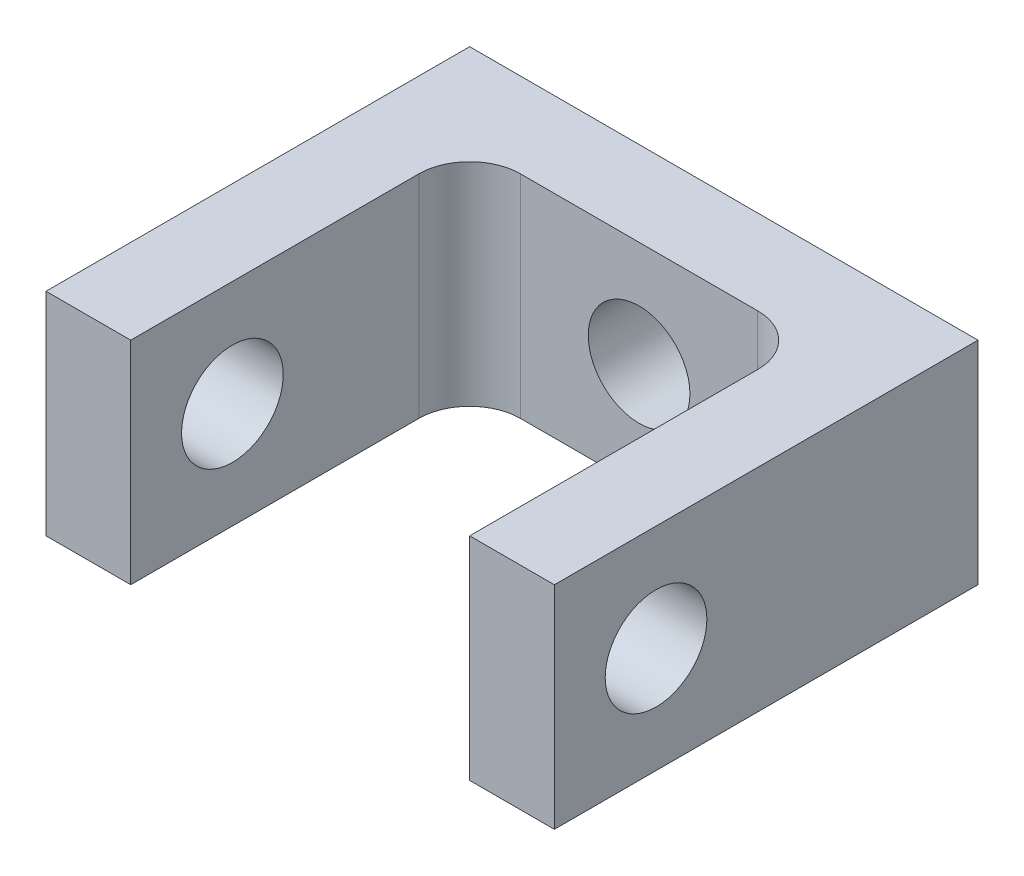
ISO-10303-21;
HEADER;
FILE_DESCRIPTION(('STEP AP214'),'2;1');
FILE_NAME('part.step','',(''),(''),'','','');
FILE_SCHEMA(('AUTOMOTIVE_DESIGN { 1 0 10303 214 1 1 1 1 }'));
ENDSEC;
DATA;
#1=APPLICATION_CONTEXT('core data for automotive mechanical design processes');
#2=APPLICATION_PROTOCOL_DEFINITION('international standard','automotive_design',2000,#1);
#3=PRODUCT_CONTEXT('',#1,'mechanical');
#4=PRODUCT('Part','Part','',(#3));
#5=PRODUCT_RELATED_PRODUCT_CATEGORY('part','',(#4));
#6=PRODUCT_DEFINITION_FORMATION('','',#4);
#7=PRODUCT_DEFINITION_CONTEXT('part definition',#1,'design');
#8=PRODUCT_DEFINITION('design','',#6,#7);
#9=PRODUCT_DEFINITION_SHAPE('','',#8);
#10=(LENGTH_UNIT() NAMED_UNIT(*) SI_UNIT(.MILLI.,.METRE.));
#11=(NAMED_UNIT(*) PLANE_ANGLE_UNIT() SI_UNIT($,.RADIAN.));
#12=(NAMED_UNIT(*) SI_UNIT($,.STERADIAN.) SOLID_ANGLE_UNIT());
#13=UNCERTAINTY_MEASURE_WITH_UNIT(LENGTH_MEASURE(1.E-05),#10,'distance_accuracy_value','');
#14=(GEOMETRIC_REPRESENTATION_CONTEXT(3) GLOBAL_UNCERTAINTY_ASSIGNED_CONTEXT((#13)) GLOBAL_UNIT_ASSIGNED_CONTEXT((#10,
#11,#12)) REPRESENTATION_CONTEXT('',''));
#15=CARTESIAN_POINT('',(0.,0.,0.));
#16=DIRECTION('',(0.,0.,1.));
#17=DIRECTION('',(1.,0.,0.));
#18=AXIS2_PLACEMENT_3D('',#15,#16,#17);
#19=CARTESIAN_POINT('',(0.,0.,10.));
#20=DIRECTION('',(0.,0.,-1.));
#21=DIRECTION('',(-1.,0.,0.));
#22=AXIS2_PLACEMENT_3D('',#19,#20,#21);
#23=PLANE('',#22);
#24=CARTESIAN_POINT('',(0.,0.,10.));
#25=DIRECTION('',(0.,0.,1.));
#26=DIRECTION('',(1.,0.,0.));
#27=AXIS2_PLACEMENT_3D('',#24,#25,#26);
#28=CIRCLE('',#27,6.);
#29=CARTESIAN_POINT('',(6.,0.,10.));
#30=VERTEX_POINT('',#29);
#31=EDGE_CURVE('E166',#30,#30,#28,.T.);
#32=ORIENTED_EDGE('',*,*,#31,.F.);
#33=EDGE_LOOP('',(#32));
#34=FACE_BOUND('',#33,.T.);
#35=DIRECTION('',(1.,0.,0.));
#36=VECTOR('',#35,1.);
#37=CARTESIAN_POINT('',(30.,-12.5,10.));
#38=LINE('',#37,#36);
#39=CARTESIAN_POINT('',(-14.,-12.5,10.));
#40=VERTEX_POINT('',#39);
#41=CARTESIAN_POINT('',(14.,-12.5,10.));
#42=VERTEX_POINT('',#41);
#43=EDGE_CURVE('E172',#40,#42,#38,.T.);
#44=ORIENTED_EDGE('',*,*,#43,.T.);
#45=DIRECTION('',(0.,-1.,0.));
#46=VECTOR('',#45,1.);
#47=CARTESIAN_POINT('',(14.,12.5,10.));
#48=LINE('',#47,#46);
#49=CARTESIAN_POINT('',(14.,12.5,10.));
#50=VERTEX_POINT('',#49);
#51=EDGE_CURVE('E196',#42,#50,#48,.F.);
#52=ORIENTED_EDGE('',*,*,#51,.T.);
#53=DIRECTION('',(-1.,0.,0.));
#54=VECTOR('',#53,1.);
#55=CARTESIAN_POINT('',(30.,12.5,10.));
#56=LINE('',#55,#54);
#57=CARTESIAN_POINT('',(-14.,12.5,10.));
#58=VERTEX_POINT('',#57);
#59=EDGE_CURVE('E175',#50,#58,#56,.T.);
#60=ORIENTED_EDGE('',*,*,#59,.T.);
#61=DIRECTION('',(0.,1.,0.));
#62=VECTOR('',#61,1.);
#63=CARTESIAN_POINT('',(-14.,-12.5,10.));
#64=LINE('',#63,#62);
#65=EDGE_CURVE('E194',#58,#40,#64,.F.);
#66=ORIENTED_EDGE('',*,*,#65,.T.);
#67=EDGE_LOOP('',(#44,#52,#60,#66));
#68=FACE_BOUND('',#67,.T.);
#69=ADVANCED_FACE('F33',(#34,#68),#23,.F.);
#70=CARTESIAN_POINT('',(0.,0.,0.));
#71=DIRECTION('',(0.,0.,-1.));
#72=DIRECTION('',(-1.,0.,0.));
#73=AXIS2_PLACEMENT_3D('',#70,#71,#72);
#74=PLANE('',#73);
#75=DIRECTION('',(0.,-1.,0.));
#76=VECTOR('',#75,1.);
#77=CARTESIAN_POINT('',(-30.,12.5,0.));
#78=LINE('',#77,#76);
#79=CARTESIAN_POINT('',(-30.,12.5,0.));
#80=VERTEX_POINT('',#79);
#81=CARTESIAN_POINT('',(-30.,-12.5,0.));
#82=VERTEX_POINT('',#81);
#83=EDGE_CURVE('E169',#80,#82,#78,.T.);
#84=ORIENTED_EDGE('',*,*,#83,.F.);
#85=DIRECTION('',(-1.,0.,0.));
#86=VECTOR('',#85,1.);
#87=CARTESIAN_POINT('',(30.,12.5,0.));
#88=LINE('',#87,#86);
#89=CARTESIAN_POINT('',(30.,12.5,0.));
#90=VERTEX_POINT('',#89);
#91=EDGE_CURVE('E176',#90,#80,#88,.T.);
#92=ORIENTED_EDGE('',*,*,#91,.F.);
#93=DIRECTION('',(0.,1.,0.));
#94=VECTOR('',#93,1.);
#95=CARTESIAN_POINT('',(30.,12.5,0.));
#96=LINE('',#95,#94);
#97=CARTESIAN_POINT('',(30.,-12.5,0.));
#98=VERTEX_POINT('',#97);
#99=EDGE_CURVE('E118',#98,#90,#96,.T.);
#100=ORIENTED_EDGE('',*,*,#99,.F.);
#101=DIRECTION('',(1.,0.,0.));
#102=VECTOR('',#101,1.);
#103=CARTESIAN_POINT('',(30.,-12.5,0.));
#104=LINE('',#103,#102);
#105=EDGE_CURVE('E181',#82,#98,#104,.T.);
#106=ORIENTED_EDGE('',*,*,#105,.F.);
#107=EDGE_LOOP('',(#84,#92,#100,#106));
#108=FACE_BOUND('',#107,.T.);
#109=CARTESIAN_POINT('',(0.,0.,0.));
#110=DIRECTION('',(0.,0.,1.));
#111=DIRECTION('',(1.,0.,0.));
#112=AXIS2_PLACEMENT_3D('',#109,#110,#111);
#113=CIRCLE('',#112,6.);
#114=CARTESIAN_POINT('',(6.,0.,0.));
#115=VERTEX_POINT('',#114);
#116=EDGE_CURVE('E165',#115,#115,#113,.T.);
#117=ORIENTED_EDGE('',*,*,#116,.T.);
#118=EDGE_LOOP('',(#117));
#119=FACE_BOUND('',#118,.T.);
#120=ADVANCED_FACE('F222',(#108,#119),#74,.T.);
#121=CARTESIAN_POINT('',(-30.,12.5,10.));
#122=DIRECTION('',(1.,0.,0.));
#123=DIRECTION('',(0.,1.,0.));
#124=AXIS2_PLACEMENT_3D('',#121,#122,#123);
#125=PLANE('',#124);
#126=CARTESIAN_POINT('',(-30.,0.,38.));
#127=DIRECTION('',(-1.,0.,0.));
#128=DIRECTION('',(0.,-1.,0.));
#129=AXIS2_PLACEMENT_3D('',#126,#127,#128);
#130=CIRCLE('',#129,5.99999999999999);
#131=CARTESIAN_POINT('',(-30.,-6.,38.));
#132=VERTEX_POINT('',#131);
#133=EDGE_CURVE('E262',#132,#132,#130,.T.);
#134=ORIENTED_EDGE('',*,*,#133,.F.);
#135=EDGE_LOOP('',(#134));
#136=FACE_BOUND('',#135,.T.);
#137=ORIENTED_EDGE('',*,*,#83,.T.);
#138=DIRECTION('',(0.,0.,-1.));
#139=VECTOR('',#138,1.);
#140=CARTESIAN_POINT('',(-30.,-12.5,10.));
#141=LINE('',#140,#139);
#142=CARTESIAN_POINT('',(-30.,-12.5,50.));
#143=VERTEX_POINT('',#142);
#144=EDGE_CURVE('E188',#143,#82,#141,.T.);
#145=ORIENTED_EDGE('',*,*,#144,.F.);
#146=DIRECTION('',(0.,-1.,0.));
#147=VECTOR('',#146,1.);
#148=CARTESIAN_POINT('',(-30.,12.5,50.));
#149=LINE('',#148,#147);
#150=CARTESIAN_POINT('',(-30.,12.5,50.));
#151=VERTEX_POINT('',#150);
#152=EDGE_CURVE('E150',#151,#143,#149,.T.);
#153=ORIENTED_EDGE('',*,*,#152,.F.);
#154=DIRECTION('',(0.,0.,-1.));
#155=VECTOR('',#154,1.);
#156=CARTESIAN_POINT('',(-30.,12.5,10.));
#157=LINE('',#156,#155);
#158=EDGE_CURVE('E122',#151,#80,#157,.T.);
#159=ORIENTED_EDGE('',*,*,#158,.T.);
#160=EDGE_LOOP('',(#137,#145,#153,#159));
#161=FACE_BOUND('',#160,.T.);
#162=ADVANCED_FACE('F219',(#136,#161),#125,.F.);
#163=CARTESIAN_POINT('',(30.,-12.5,10.));
#164=DIRECTION('',(0.,1.,0.));
#165=DIRECTION('',(-1.,0.,0.));
#166=AXIS2_PLACEMENT_3D('',#163,#164,#165);
#167=PLANE('',#166);
#168=ORIENTED_EDGE('',*,*,#105,.T.);
#169=DIRECTION('',(0.,0.,-1.));
#170=VECTOR('',#169,1.);
#171=CARTESIAN_POINT('',(30.,-12.5,10.));
#172=LINE('',#171,#170);
#173=CARTESIAN_POINT('',(30.,-12.5,50.));
#174=VERTEX_POINT('',#173);
#175=EDGE_CURVE('E121',#174,#98,#172,.T.);
#176=ORIENTED_EDGE('',*,*,#175,.F.);
#177=DIRECTION('',(1.,0.,0.));
#178=VECTOR('',#177,1.);
#179=CARTESIAN_POINT('',(30.,-12.5,50.));
#180=LINE('',#179,#178);
#181=CARTESIAN_POINT('',(20.,-12.5,50.));
#182=VERTEX_POINT('',#181);
#183=EDGE_CURVE('E136',#182,#174,#180,.T.);
#184=ORIENTED_EDGE('',*,*,#183,.F.);
#185=DIRECTION('',(0.,0.,-1.));
#186=VECTOR('',#185,1.);
#187=CARTESIAN_POINT('',(20.,-12.5,50.));
#188=LINE('',#187,#186);
#189=CARTESIAN_POINT('',(20.,-12.5,16.));
#190=VERTEX_POINT('',#189);
#191=EDGE_CURVE('E146',#182,#190,#188,.T.);
#192=ORIENTED_EDGE('',*,*,#191,.T.);
#193=CARTESIAN_POINT('',(14.,-12.5,16.));
#194=DIRECTION('',(0.,1.,0.));
#195=DIRECTION('',(-1.,0.,0.));
#196=AXIS2_PLACEMENT_3D('',#193,#194,#195);
#197=CIRCLE('',#196,6.);
#198=EDGE_CURVE('E200',#190,#42,#197,.T.);
#199=ORIENTED_EDGE('',*,*,#198,.T.);
#200=ORIENTED_EDGE('',*,*,#43,.F.);
#201=CARTESIAN_POINT('',(-14.,-12.5,16.));
#202=DIRECTION('',(0.,1.,0.));
#203=DIRECTION('',(-1.,0.,0.));
#204=AXIS2_PLACEMENT_3D('',#201,#202,#203);
#205=CIRCLE('',#204,6.);
#206=CARTESIAN_POINT('',(-20.,-12.5,16.));
#207=VERTEX_POINT('',#206);
#208=EDGE_CURVE('E11',#40,#207,#205,.T.);
#209=ORIENTED_EDGE('',*,*,#208,.T.);
#210=DIRECTION('',(0.,0.,-1.));
#211=VECTOR('',#210,1.);
#212=CARTESIAN_POINT('',(-20.,-12.5,50.));
#213=LINE('',#212,#211);
#214=CARTESIAN_POINT('',(-20.,-12.5,50.));
#215=VERTEX_POINT('',#214);
#216=EDGE_CURVE('E163',#215,#207,#213,.T.);
#217=ORIENTED_EDGE('',*,*,#216,.F.);
#218=DIRECTION('',(1.,0.,0.));
#219=VECTOR('',#218,1.);
#220=CARTESIAN_POINT('',(-30.,-12.5,50.));
#221=LINE('',#220,#219);
#222=EDGE_CURVE('E153',#143,#215,#221,.T.);
#223=ORIENTED_EDGE('',*,*,#222,.F.);
#224=ORIENTED_EDGE('',*,*,#144,.T.);
#225=EDGE_LOOP('',(#168,#176,#184,#192,#199,#200,#209,#217,#223,#224));
#226=FACE_BOUND('',#225,.T.);
#227=ADVANCED_FACE('F214',(#226),#167,.F.);
#228=CARTESIAN_POINT('',(30.,12.5,10.));
#229=DIRECTION('',(-1.,0.,0.));
#230=DIRECTION('',(0.,0.,1.));
#231=AXIS2_PLACEMENT_3D('',#228,#229,#230);
#232=PLANE('',#231);
#233=CARTESIAN_POINT('',(30.,0.,38.));
#234=DIRECTION('',(-1.,0.,0.));
#235=DIRECTION('',(0.,0.,1.));
#236=AXIS2_PLACEMENT_3D('',#233,#234,#235);
#237=CIRCLE('',#236,5.99999999999999);
#238=CARTESIAN_POINT('',(30.,0.,44.));
#239=VERTEX_POINT('',#238);
#240=EDGE_CURVE('E137',#239,#239,#237,.T.);
#241=ORIENTED_EDGE('',*,*,#240,.T.);
#242=EDGE_LOOP('',(#241));
#243=FACE_BOUND('',#242,.T.);
#244=ORIENTED_EDGE('',*,*,#99,.T.);
#245=DIRECTION('',(0.,0.,-1.));
#246=VECTOR('',#245,1.);
#247=CARTESIAN_POINT('',(30.,12.5,10.));
#248=LINE('',#247,#246);
#249=CARTESIAN_POINT('',(30.,12.5,50.));
#250=VERTEX_POINT('',#249);
#251=EDGE_CURVE('E111',#250,#90,#248,.T.);
#252=ORIENTED_EDGE('',*,*,#251,.F.);
#253=DIRECTION('',(0.,1.,0.));
#254=VECTOR('',#253,1.);
#255=CARTESIAN_POINT('',(30.,12.5,50.));
#256=LINE('',#255,#254);
#257=EDGE_CURVE('E116',#174,#250,#256,.T.);
#258=ORIENTED_EDGE('',*,*,#257,.F.);
#259=ORIENTED_EDGE('',*,*,#175,.T.);
#260=EDGE_LOOP('',(#244,#252,#258,#259));
#261=FACE_BOUND('',#260,.T.);
#262=ADVANCED_FACE('F113',(#243,#261),#232,.F.);
#263=CARTESIAN_POINT('',(30.,12.5,10.));
#264=DIRECTION('',(0.,-1.,0.));
#265=DIRECTION('',(1.,0.,0.));
#266=AXIS2_PLACEMENT_3D('',#263,#264,#265);
#267=PLANE('',#266);
#268=ORIENTED_EDGE('',*,*,#91,.T.);
#269=ORIENTED_EDGE('',*,*,#158,.F.);
#270=DIRECTION('',(-1.,0.,0.));
#271=VECTOR('',#270,1.);
#272=CARTESIAN_POINT('',(-30.,12.5,50.));
#273=LINE('',#272,#271);
#274=CARTESIAN_POINT('',(-20.,12.5,50.));
#275=VERTEX_POINT('',#274);
#276=EDGE_CURVE('E157',#275,#151,#273,.T.);
#277=ORIENTED_EDGE('',*,*,#276,.F.);
#278=DIRECTION('',(0.,0.,-1.));
#279=VECTOR('',#278,1.);
#280=CARTESIAN_POINT('',(-20.,12.5,50.));
#281=LINE('',#280,#279);
#282=CARTESIAN_POINT('',(-20.,12.5,16.));
#283=VERTEX_POINT('',#282);
#284=EDGE_CURVE('E160',#275,#283,#281,.T.);
#285=ORIENTED_EDGE('',*,*,#284,.T.);
#286=CARTESIAN_POINT('',(-14.,12.5,16.));
#287=DIRECTION('',(0.,-1.,0.));
#288=DIRECTION('',(1.,0.,0.));
#289=AXIS2_PLACEMENT_3D('',#286,#287,#288);
#290=CIRCLE('',#289,6.);
#291=EDGE_CURVE('E42',#283,#58,#290,.T.);
#292=ORIENTED_EDGE('',*,*,#291,.T.);
#293=ORIENTED_EDGE('',*,*,#59,.F.);
#294=CARTESIAN_POINT('',(14.,12.5,16.));
#295=DIRECTION('',(0.,-1.,0.));
#296=DIRECTION('',(1.,0.,0.));
#297=AXIS2_PLACEMENT_3D('',#294,#295,#296);
#298=CIRCLE('',#297,6.);
#299=CARTESIAN_POINT('',(20.,12.5,16.));
#300=VERTEX_POINT('',#299);
#301=EDGE_CURVE('E202',#50,#300,#298,.T.);
#302=ORIENTED_EDGE('',*,*,#301,.T.);
#303=DIRECTION('',(0.,0.,-1.));
#304=VECTOR('',#303,1.);
#305=CARTESIAN_POINT('',(20.,12.5,50.));
#306=LINE('',#305,#304);
#307=CARTESIAN_POINT('',(20.,12.5,50.));
#308=VERTEX_POINT('',#307);
#309=EDGE_CURVE('E128',#308,#300,#306,.T.);
#310=ORIENTED_EDGE('',*,*,#309,.F.);
#311=DIRECTION('',(-1.,0.,0.));
#312=VECTOR('',#311,1.);
#313=CARTESIAN_POINT('',(30.,12.5,50.));
#314=LINE('',#313,#312);
#315=EDGE_CURVE('E125',#250,#308,#314,.T.);
#316=ORIENTED_EDGE('',*,*,#315,.F.);
#317=ORIENTED_EDGE('',*,*,#251,.T.);
#318=EDGE_LOOP('',(#268,#269,#277,#285,#292,#293,#302,#310,#316,#317));
#319=FACE_BOUND('',#318,.T.);
#320=ADVANCED_FACE('F126',(#319),#267,.F.);
#321=CARTESIAN_POINT('',(0.,0.,10.));
#322=DIRECTION('',(0.,0.,-1.));
#323=DIRECTION('',(-1.,0.,0.));
#324=AXIS2_PLACEMENT_3D('',#321,#322,#323);
#325=CYLINDRICAL_SURFACE('',#324,6.);
#326=ORIENTED_EDGE('',*,*,#31,.T.);
#327=EDGE_LOOP('',(#326));
#328=FACE_BOUND('',#327,.T.);
#329=ORIENTED_EDGE('',*,*,#116,.F.);
#330=EDGE_LOOP('',(#329));
#331=FACE_BOUND('',#330,.T.);
#332=ADVANCED_FACE('F247',(#328,#331),#325,.F.);
#333=CARTESIAN_POINT('',(-20.,12.5,50.));
#334=DIRECTION('',(-1.,0.,0.));
#335=DIRECTION('',(0.,-1.,0.));
#336=AXIS2_PLACEMENT_3D('',#333,#334,#335);
#337=PLANE('',#336);
#338=CARTESIAN_POINT('',(-20.,0.,38.));
#339=DIRECTION('',(-1.,0.,0.));
#340=DIRECTION('',(0.,-1.,0.));
#341=AXIS2_PLACEMENT_3D('',#338,#339,#340);
#342=CIRCLE('',#341,5.99999999999999);
#343=CARTESIAN_POINT('',(-20.,-6.,38.));
#344=VERTEX_POINT('',#343);
#345=EDGE_CURVE('E140',#344,#344,#342,.T.);
#346=ORIENTED_EDGE('',*,*,#345,.T.);
#347=EDGE_LOOP('',(#346));
#348=FACE_BOUND('',#347,.T.);
#349=ORIENTED_EDGE('',*,*,#216,.T.);
#350=DIRECTION('',(0.,1.,0.));
#351=VECTOR('',#350,1.);
#352=CARTESIAN_POINT('',(-20.,12.5,16.));
#353=LINE('',#352,#351);
#354=EDGE_CURVE('E198',#207,#283,#353,.T.);
#355=ORIENTED_EDGE('',*,*,#354,.T.);
#356=ORIENTED_EDGE('',*,*,#284,.F.);
#357=DIRECTION('',(0.,1.,0.));
#358=VECTOR('',#357,1.);
#359=CARTESIAN_POINT('',(-20.,12.5,50.));
#360=LINE('',#359,#358);
#361=EDGE_CURVE('E155',#215,#275,#360,.T.);
#362=ORIENTED_EDGE('',*,*,#361,.F.);
#363=EDGE_LOOP('',(#349,#355,#356,#362));
#364=FACE_BOUND('',#363,.T.);
#365=ADVANCED_FACE('F211',(#348,#364),#337,.F.);
#366=CARTESIAN_POINT('',(0.,0.,50.));
#367=DIRECTION('',(0.,0.,1.));
#368=DIRECTION('',(1.,0.,0.));
#369=AXIS2_PLACEMENT_3D('',#366,#367,#368);
#370=PLANE('',#369);
#371=ORIENTED_EDGE('',*,*,#152,.T.);
#372=ORIENTED_EDGE('',*,*,#222,.T.);
#373=ORIENTED_EDGE('',*,*,#361,.T.);
#374=ORIENTED_EDGE('',*,*,#276,.T.);
#375=EDGE_LOOP('',(#371,#372,#373,#374));
#376=FACE_BOUND('',#375,.T.);
#377=ADVANCED_FACE('F217',(#376),#370,.T.);
#378=CARTESIAN_POINT('',(20.,12.5,50.));
#379=DIRECTION('',(1.,0.,0.));
#380=DIRECTION('',(0.,0.,-1.));
#381=AXIS2_PLACEMENT_3D('',#378,#379,#380);
#382=PLANE('',#381);
#383=CARTESIAN_POINT('',(20.,0.,38.));
#384=DIRECTION('',(1.,0.,0.));
#385=DIRECTION('',(0.,0.,-1.));
#386=AXIS2_PLACEMENT_3D('',#383,#384,#385);
#387=CIRCLE('',#386,5.99999999999999);
#388=CARTESIAN_POINT('',(20.,0.,32.));
#389=VERTEX_POINT('',#388);
#390=EDGE_CURVE('E37',#389,#389,#387,.T.);
#391=ORIENTED_EDGE('',*,*,#390,.T.);
#392=EDGE_LOOP('',(#391));
#393=FACE_BOUND('',#392,.T.);
#394=ORIENTED_EDGE('',*,*,#309,.T.);
#395=DIRECTION('',(0.,-1.,0.));
#396=VECTOR('',#395,1.);
#397=CARTESIAN_POINT('',(20.,-12.5,16.));
#398=LINE('',#397,#396);
#399=EDGE_CURVE('E191',#300,#190,#398,.T.);
#400=ORIENTED_EDGE('',*,*,#399,.T.);
#401=ORIENTED_EDGE('',*,*,#191,.F.);
#402=DIRECTION('',(0.,-1.,0.));
#403=VECTOR('',#402,1.);
#404=CARTESIAN_POINT('',(20.,12.5,50.));
#405=LINE('',#404,#403);
#406=EDGE_CURVE('E131',#308,#182,#405,.T.);
#407=ORIENTED_EDGE('',*,*,#406,.F.);
#408=EDGE_LOOP('',(#394,#400,#401,#407));
#409=FACE_BOUND('',#408,.T.);
#410=ADVANCED_FACE('F226',(#393,#409),#382,.F.);
#411=CARTESIAN_POINT('',(0.,0.,50.));
#412=DIRECTION('',(0.,0.,-1.));
#413=DIRECTION('',(-1.,0.,0.));
#414=AXIS2_PLACEMENT_3D('',#411,#412,#413);
#415=PLANE('',#414);
#416=ORIENTED_EDGE('',*,*,#257,.T.);
#417=ORIENTED_EDGE('',*,*,#315,.T.);
#418=ORIENTED_EDGE('',*,*,#406,.T.);
#419=ORIENTED_EDGE('',*,*,#183,.T.);
#420=EDGE_LOOP('',(#416,#417,#418,#419));
#421=FACE_BOUND('',#420,.T.);
#422=ADVANCED_FACE('F134',(#421),#415,.F.);
#423=CARTESIAN_POINT('',(14.,12.5,16.));
#424=DIRECTION('',(0.,1.,0.));
#425=DIRECTION('',(0.,0.,1.));
#426=AXIS2_PLACEMENT_3D('',#423,#424,#425);
#427=CYLINDRICAL_SURFACE('',#426,6.);
#428=ORIENTED_EDGE('',*,*,#301,.F.);
#429=ORIENTED_EDGE('',*,*,#51,.F.);
#430=ORIENTED_EDGE('',*,*,#198,.F.);
#431=ORIENTED_EDGE('',*,*,#399,.F.);
#432=EDGE_LOOP('',(#428,#429,#430,#431));
#433=FACE_BOUND('',#432,.T.);
#434=ADVANCED_FACE('F229',(#433),#427,.F.);
#435=CARTESIAN_POINT('',(-14.,12.5,16.));
#436=DIRECTION('',(0.,-1.,0.));
#437=DIRECTION('',(1.,0.,0.));
#438=AXIS2_PLACEMENT_3D('',#435,#436,#437);
#439=CYLINDRICAL_SURFACE('',#438,6.);
#440=ORIENTED_EDGE('',*,*,#208,.F.);
#441=ORIENTED_EDGE('',*,*,#65,.F.);
#442=ORIENTED_EDGE('',*,*,#291,.F.);
#443=ORIENTED_EDGE('',*,*,#354,.F.);
#444=EDGE_LOOP('',(#440,#441,#442,#443));
#445=FACE_BOUND('',#444,.T.);
#446=ADVANCED_FACE('F35',(#445),#439,.F.);
#447=CARTESIAN_POINT('',(40.,0.,38.));
#448=DIRECTION('',(-1.,0.,0.));
#449=DIRECTION('',(0.,-1.,0.));
#450=AXIS2_PLACEMENT_3D('',#447,#448,#449);
#451=CYLINDRICAL_SURFACE('',#450,5.99999999999999);
#452=ORIENTED_EDGE('',*,*,#390,.F.);
#453=EDGE_LOOP('',(#452));
#454=FACE_BOUND('',#453,.T.);
#455=ORIENTED_EDGE('',*,*,#240,.F.);
#456=EDGE_LOOP('',(#455));
#457=FACE_BOUND('',#456,.T.);
#458=ADVANCED_FACE('F235',(#454,#457),#451,.F.);
#459=ORIENTED_EDGE('',*,*,#133,.T.);
#460=EDGE_LOOP('',(#459));
#461=FACE_BOUND('',#460,.T.);
#462=ORIENTED_EDGE('',*,*,#345,.F.);
#463=EDGE_LOOP('',(#462));
#464=FACE_BOUND('',#463,.T.);
#465=ADVANCED_FACE('F270',(#461,#464),#451,.F.);
#466=CLOSED_SHELL('',(#69,#120,#162,#227,#262,#320,#332,#365,#377,#410,#422,#434,#446,#458,#465));
#467=MANIFOLD_SOLID_BREP('B2',#466);
#468=ADVANCED_BREP_SHAPE_REPRESENTATION('',(#18,#467),#14);
#469=SHAPE_DEFINITION_REPRESENTATION(#9,#468);
ENDSEC;
END-ISO-10303-21;
